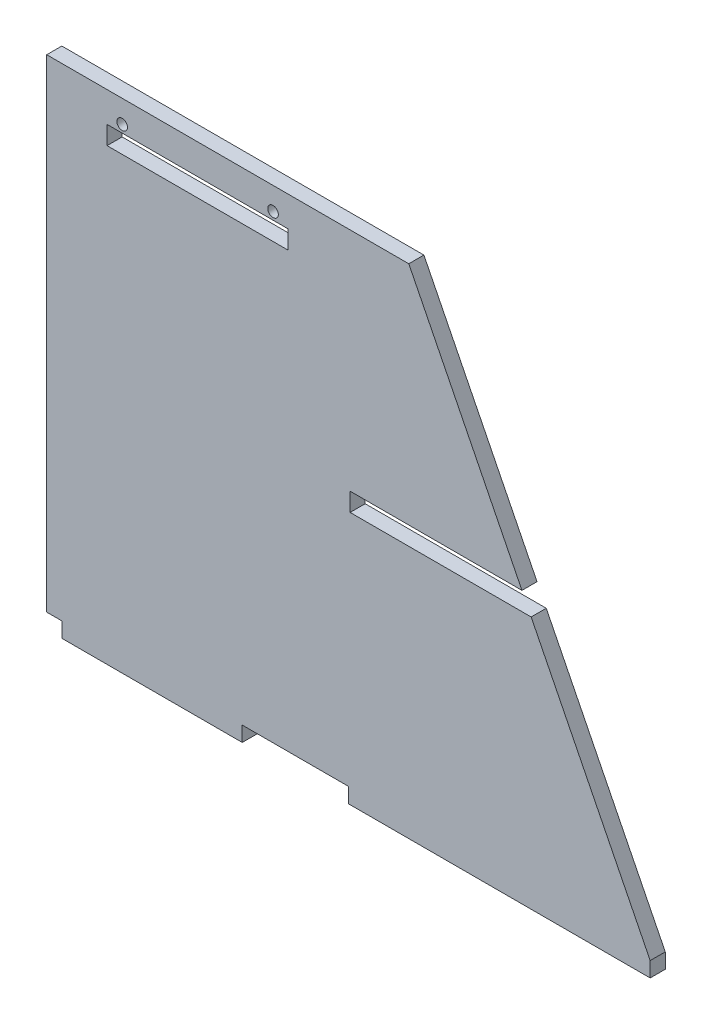
ISO-10303-21;
HEADER;
FILE_DESCRIPTION(('STEP AP214'),'2;1');
FILE_NAME('part.step','',(''),(''),'','','');
FILE_SCHEMA(('AUTOMOTIVE_DESIGN { 1 0 10303 214 1 1 1 1 }'));
ENDSEC;
DATA;
#1=APPLICATION_CONTEXT('core data for automotive mechanical design processes');
#2=APPLICATION_PROTOCOL_DEFINITION('international standard','automotive_design',2000,#1);
#3=PRODUCT_CONTEXT('',#1,'mechanical');
#4=PRODUCT('Part','Part','',(#3));
#5=PRODUCT_RELATED_PRODUCT_CATEGORY('part','',(#4));
#6=PRODUCT_DEFINITION_FORMATION('','',#4);
#7=PRODUCT_DEFINITION_CONTEXT('part definition',#1,'design');
#8=PRODUCT_DEFINITION('design','',#6,#7);
#9=PRODUCT_DEFINITION_SHAPE('','',#8);
#10=(LENGTH_UNIT() NAMED_UNIT(*) SI_UNIT(.MILLI.,.METRE.));
#11=(NAMED_UNIT(*) PLANE_ANGLE_UNIT() SI_UNIT($,.RADIAN.));
#12=(NAMED_UNIT(*) SI_UNIT($,.STERADIAN.) SOLID_ANGLE_UNIT());
#13=UNCERTAINTY_MEASURE_WITH_UNIT(LENGTH_MEASURE(1.E-05),#10,'distance_accuracy_value','');
#14=(GEOMETRIC_REPRESENTATION_CONTEXT(3) GLOBAL_UNCERTAINTY_ASSIGNED_CONTEXT((#13)) GLOBAL_UNIT_ASSIGNED_CONTEXT((#10,
#11,#12)) REPRESENTATION_CONTEXT('',''));
#15=CARTESIAN_POINT('',(0.,0.,0.));
#16=DIRECTION('',(0.,0.,1.));
#17=DIRECTION('',(1.,0.,0.));
#18=AXIS2_PLACEMENT_3D('',#15,#16,#17);
#19=CARTESIAN_POINT('',(160.,80.,5.));
#20=DIRECTION('',(0.894427190999916,0.447213595499958,0.));
#21=DIRECTION('',(-0.447213595499958,0.894427190999916,0.));
#22=AXIS2_PLACEMENT_3D('',#19,#20,#21);
#23=PLANE('',#22);
#24=DIRECTION('',(0.,0.,1.));
#25=VECTOR('',#24,1.);
#26=CARTESIAN_POINT('',(160.55,78.9,0.));
#27=LINE('',#26,#25);
#28=CARTESIAN_POINT('',(160.55,78.9,0.));
#29=VERTEX_POINT('',#28);
#30=CARTESIAN_POINT('',(160.55,78.9,5.));
#31=VERTEX_POINT('',#30);
#32=EDGE_CURVE('E208',#29,#31,#27,.T.);
#33=ORIENTED_EDGE('',*,*,#32,.T.);
#34=DIRECTION('',(0.447213595499958,-0.894427190999916,0.));
#35=VECTOR('',#34,1.);
#36=CARTESIAN_POINT('',(160.,80.,5.));
#37=LINE('',#36,#35);
#38=CARTESIAN_POINT('',(200.,0.,5.));
#39=VERTEX_POINT('',#38);
#40=EDGE_CURVE('E278',#31,#39,#37,.T.);
#41=ORIENTED_EDGE('',*,*,#40,.T.);
#42=DIRECTION('',(0.,0.,-1.));
#43=VECTOR('',#42,1.);
#44=CARTESIAN_POINT('',(200.,0.,5.));
#45=LINE('',#44,#43);
#46=CARTESIAN_POINT('',(200.,0.,0.));
#47=VERTEX_POINT('',#46);
#48=EDGE_CURVE('E296',#39,#47,#45,.T.);
#49=ORIENTED_EDGE('',*,*,#48,.T.);
#50=DIRECTION('',(0.447213595499958,-0.894427190999916,0.));
#51=VECTOR('',#50,1.);
#52=CARTESIAN_POINT('',(160.,80.,0.));
#53=LINE('',#52,#51);
#54=EDGE_CURVE('E300',#29,#47,#53,.T.);
#55=ORIENTED_EDGE('',*,*,#54,.F.);
#56=EDGE_LOOP('',(#33,#41,#49,#55));
#57=FACE_BOUND('',#56,.T.);
#58=ADVANCED_FACE('F71',(#57),#23,.T.);
#59=CARTESIAN_POINT('',(0.,0.,5.));
#60=DIRECTION('',(0.,1.,0.));
#61=DIRECTION('',(-1.,0.,0.));
#62=AXIS2_PLACEMENT_3D('',#59,#60,#61);
#63=PLANE('',#62);
#64=DIRECTION('',(0.,0.,-1.));
#65=VECTOR('',#64,1.);
#66=CARTESIAN_POINT('',(5.,0.,5.));
#67=LINE('',#66,#65);
#68=CARTESIAN_POINT('',(5.,0.,5.));
#69=VERTEX_POINT('',#68);
#70=CARTESIAN_POINT('',(5.,0.,0.));
#71=VERTEX_POINT('',#70);
#72=EDGE_CURVE('E79',#69,#71,#67,.T.);
#73=ORIENTED_EDGE('',*,*,#72,.F.);
#74=DIRECTION('',(1.,0.,0.));
#75=VECTOR('',#74,1.);
#76=CARTESIAN_POINT('',(0.,0.,5.));
#77=LINE('',#76,#75);
#78=CARTESIAN_POINT('',(0.,0.,5.));
#79=VERTEX_POINT('',#78);
#80=EDGE_CURVE('E285',#79,#69,#77,.T.);
#81=ORIENTED_EDGE('',*,*,#80,.F.);
#82=DIRECTION('',(0.,0.,-1.));
#83=VECTOR('',#82,1.);
#84=CARTESIAN_POINT('',(0.,0.,5.));
#85=LINE('',#84,#83);
#86=CARTESIAN_POINT('',(0.,0.,0.));
#87=VERTEX_POINT('',#86);
#88=EDGE_CURVE('E328',#79,#87,#85,.T.);
#89=ORIENTED_EDGE('',*,*,#88,.T.);
#90=DIRECTION('',(1.,0.,0.));
#91=VECTOR('',#90,1.);
#92=CARTESIAN_POINT('',(0.,0.,0.));
#93=LINE('',#92,#91);
#94=EDGE_CURVE('E307',#87,#71,#93,.T.);
#95=ORIENTED_EDGE('',*,*,#94,.T.);
#96=EDGE_LOOP('',(#73,#81,#89,#95));
#97=FACE_BOUND('',#96,.T.);
#98=ADVANCED_FACE('F395',(#97),#63,.F.);
#99=DIRECTION('',(0.,0.,1.));
#100=VECTOR('',#99,1.);
#101=CARTESIAN_POINT('',(157.5,85.,5.));
#102=LINE('',#101,#100);
#103=CARTESIAN_POINT('',(157.5,85.,0.));
#104=VERTEX_POINT('',#103);
#105=CARTESIAN_POINT('',(157.5,85.,5.));
#106=VERTEX_POINT('',#105);
#107=EDGE_CURVE('E227',#104,#106,#102,.T.);
#108=ORIENTED_EDGE('',*,*,#107,.F.);
#109=CARTESIAN_POINT('',(120.,160.,0.));
#110=VERTEX_POINT('',#109);
#111=EDGE_CURVE('E297',#110,#104,#53,.T.);
#112=ORIENTED_EDGE('',*,*,#111,.F.);
#113=DIRECTION('',(0.,0.,-1.));
#114=VECTOR('',#113,1.);
#115=CARTESIAN_POINT('',(120.,160.,5.));
#116=LINE('',#115,#114);
#117=CARTESIAN_POINT('',(120.,160.,5.));
#118=VERTEX_POINT('',#117);
#119=EDGE_CURVE('E332',#118,#110,#116,.T.);
#120=ORIENTED_EDGE('',*,*,#119,.F.);
#121=EDGE_CURVE('E274',#118,#106,#37,.T.);
#122=ORIENTED_EDGE('',*,*,#121,.T.);
#123=EDGE_LOOP('',(#108,#112,#120,#122));
#124=FACE_BOUND('',#123,.T.);
#125=ADVANCED_FACE('F406',(#124),#23,.T.);
#126=CARTESIAN_POINT('',(0.,160.,5.));
#127=DIRECTION('',(0.,1.,0.));
#128=DIRECTION('',(0.,0.,1.));
#129=AXIS2_PLACEMENT_3D('',#126,#127,#128);
#130=PLANE('',#129);
#131=DIRECTION('',(1.,0.,0.));
#132=VECTOR('',#131,1.);
#133=CARTESIAN_POINT('',(0.,160.,0.));
#134=LINE('',#133,#132);
#135=CARTESIAN_POINT('',(0.,160.,0.));
#136=VERTEX_POINT('',#135);
#137=EDGE_CURVE('E299',#136,#110,#134,.T.);
#138=ORIENTED_EDGE('',*,*,#137,.F.);
#139=DIRECTION('',(0.,0.,-1.));
#140=VECTOR('',#139,1.);
#141=CARTESIAN_POINT('',(0.,160.,5.));
#142=LINE('',#141,#140);
#143=CARTESIAN_POINT('',(0.,160.,5.));
#144=VERTEX_POINT('',#143);
#145=EDGE_CURVE('E330',#144,#136,#142,.T.);
#146=ORIENTED_EDGE('',*,*,#145,.F.);
#147=DIRECTION('',(1.,0.,0.));
#148=VECTOR('',#147,1.);
#149=CARTESIAN_POINT('',(0.,160.,5.));
#150=LINE('',#149,#148);
#151=EDGE_CURVE('E277',#144,#118,#150,.T.);
#152=ORIENTED_EDGE('',*,*,#151,.T.);
#153=ORIENTED_EDGE('',*,*,#119,.T.);
#154=EDGE_LOOP('',(#138,#146,#152,#153));
#155=FACE_BOUND('',#154,.T.);
#156=ADVANCED_FACE('F402',(#155),#130,.T.);
#157=CARTESIAN_POINT('',(0.,0.,5.));
#158=DIRECTION('',(-1.,0.,0.));
#159=DIRECTION('',(0.,0.,1.));
#160=AXIS2_PLACEMENT_3D('',#157,#158,#159);
#161=PLANE('',#160);
#162=DIRECTION('',(0.,1.,0.));
#163=VECTOR('',#162,1.);
#164=CARTESIAN_POINT('',(0.,0.,0.));
#165=LINE('',#164,#163);
#166=EDGE_CURVE('E303',#87,#136,#165,.T.);
#167=ORIENTED_EDGE('',*,*,#166,.F.);
#168=ORIENTED_EDGE('',*,*,#88,.F.);
#169=DIRECTION('',(0.,1.,0.));
#170=VECTOR('',#169,1.);
#171=CARTESIAN_POINT('',(0.,0.,5.));
#172=LINE('',#171,#170);
#173=EDGE_CURVE('E281',#79,#144,#172,.T.);
#174=ORIENTED_EDGE('',*,*,#173,.T.);
#175=ORIENTED_EDGE('',*,*,#145,.T.);
#176=EDGE_LOOP('',(#167,#168,#174,#175));
#177=FACE_BOUND('',#176,.T.);
#178=ADVANCED_FACE('F398',(#177),#161,.T.);
#179=CARTESIAN_POINT('',(64.8,0.,5.));
#180=VERTEX_POINT('',#179);
#181=CARTESIAN_POINT('',(100.,0.,5.));
#182=VERTEX_POINT('',#181);
#183=EDGE_CURVE('E284',#180,#182,#77,.T.);
#184=ORIENTED_EDGE('',*,*,#183,.F.);
#185=DIRECTION('',(0.,0.,-1.));
#186=VECTOR('',#185,1.);
#187=CARTESIAN_POINT('',(64.8,0.,5.));
#188=LINE('',#187,#186);
#189=CARTESIAN_POINT('',(64.8,0.,0.));
#190=VERTEX_POINT('',#189);
#191=EDGE_CURVE('E334',#180,#190,#188,.T.);
#192=ORIENTED_EDGE('',*,*,#191,.T.);
#193=CARTESIAN_POINT('',(100.,0.,0.));
#194=VERTEX_POINT('',#193);
#195=EDGE_CURVE('E306',#190,#194,#93,.T.);
#196=ORIENTED_EDGE('',*,*,#195,.T.);
#197=DIRECTION('',(0.,0.,-1.));
#198=VECTOR('',#197,1.);
#199=CARTESIAN_POINT('',(100.,0.,5.));
#200=LINE('',#199,#198);
#201=EDGE_CURVE('E325',#182,#194,#200,.T.);
#202=ORIENTED_EDGE('',*,*,#201,.F.);
#203=EDGE_LOOP('',(#184,#192,#196,#202));
#204=FACE_BOUND('',#203,.T.);
#205=ADVANCED_FACE('F378',(#204),#63,.F.);
#206=CARTESIAN_POINT('',(100.,0.,5.));
#207=DIRECTION('',(1.,0.,0.));
#208=DIRECTION('',(0.,0.,-1.));
#209=AXIS2_PLACEMENT_3D('',#206,#207,#208);
#210=PLANE('',#209);
#211=DIRECTION('',(0.,-1.,0.));
#212=VECTOR('',#211,1.);
#213=CARTESIAN_POINT('',(100.,0.,0.));
#214=LINE('',#213,#212);
#215=CARTESIAN_POINT('',(100.,-5.00000000000001,0.));
#216=VERTEX_POINT('',#215);
#217=EDGE_CURVE('E310',#194,#216,#214,.T.);
#218=ORIENTED_EDGE('',*,*,#217,.T.);
#219=DIRECTION('',(0.,0.,-1.));
#220=VECTOR('',#219,1.);
#221=CARTESIAN_POINT('',(100.,-5.00000000000001,5.));
#222=LINE('',#221,#220);
#223=CARTESIAN_POINT('',(100.,-5.00000000000001,5.));
#224=VERTEX_POINT('',#223);
#225=EDGE_CURVE('E323',#224,#216,#222,.T.);
#226=ORIENTED_EDGE('',*,*,#225,.F.);
#227=DIRECTION('',(0.,-1.,0.));
#228=VECTOR('',#227,1.);
#229=CARTESIAN_POINT('',(100.,0.,5.));
#230=LINE('',#229,#228);
#231=EDGE_CURVE('E288',#182,#224,#230,.T.);
#232=ORIENTED_EDGE('',*,*,#231,.F.);
#233=ORIENTED_EDGE('',*,*,#201,.T.);
#234=EDGE_LOOP('',(#218,#226,#232,#233));
#235=FACE_BOUND('',#234,.T.);
#236=ADVANCED_FACE('F373',(#235),#210,.F.);
#237=CARTESIAN_POINT('',(0.,-5.00000000000002,5.));
#238=DIRECTION('',(0.,-1.,0.));
#239=DIRECTION('',(1.,0.,0.));
#240=AXIS2_PLACEMENT_3D('',#237,#238,#239);
#241=PLANE('',#240);
#242=DIRECTION('',(-1.,0.,0.));
#243=VECTOR('',#242,1.);
#244=CARTESIAN_POINT('',(0.,-5.00000000000002,0.));
#245=LINE('',#244,#243);
#246=CARTESIAN_POINT('',(200.,-4.99999999999999,0.));
#247=VERTEX_POINT('',#246);
#248=EDGE_CURVE('E313',#247,#216,#245,.T.);
#249=ORIENTED_EDGE('',*,*,#248,.F.);
#250=DIRECTION('',(0.,0.,-1.));
#251=VECTOR('',#250,1.);
#252=CARTESIAN_POINT('',(200.,-4.99999999999999,5.));
#253=LINE('',#252,#251);
#254=CARTESIAN_POINT('',(200.,-4.99999999999999,5.));
#255=VERTEX_POINT('',#254);
#256=EDGE_CURVE('E321',#255,#247,#253,.T.);
#257=ORIENTED_EDGE('',*,*,#256,.F.);
#258=DIRECTION('',(-1.,0.,0.));
#259=VECTOR('',#258,1.);
#260=CARTESIAN_POINT('',(0.,-5.00000000000002,5.));
#261=LINE('',#260,#259);
#262=EDGE_CURVE('E290',#255,#224,#261,.T.);
#263=ORIENTED_EDGE('',*,*,#262,.T.);
#264=ORIENTED_EDGE('',*,*,#225,.T.);
#265=EDGE_LOOP('',(#249,#257,#263,#264));
#266=FACE_BOUND('',#265,.T.);
#267=ADVANCED_FACE('F368',(#266),#241,.T.);
#268=CARTESIAN_POINT('',(200.,0.,5.));
#269=DIRECTION('',(1.,0.,0.));
#270=DIRECTION('',(0.,0.,-1.));
#271=AXIS2_PLACEMENT_3D('',#268,#269,#270);
#272=PLANE('',#271);
#273=DIRECTION('',(0.,-1.,0.));
#274=VECTOR('',#273,1.);
#275=CARTESIAN_POINT('',(200.,0.,0.));
#276=LINE('',#275,#274);
#277=EDGE_CURVE('E316',#47,#247,#276,.T.);
#278=ORIENTED_EDGE('',*,*,#277,.F.);
#279=ORIENTED_EDGE('',*,*,#48,.F.);
#280=DIRECTION('',(0.,-1.,0.));
#281=VECTOR('',#280,1.);
#282=CARTESIAN_POINT('',(200.,0.,5.));
#283=LINE('',#282,#281);
#284=EDGE_CURVE('E293',#39,#255,#283,.T.);
#285=ORIENTED_EDGE('',*,*,#284,.T.);
#286=ORIENTED_EDGE('',*,*,#256,.T.);
#287=EDGE_LOOP('',(#278,#279,#285,#286));
#288=FACE_BOUND('',#287,.T.);
#289=ADVANCED_FACE('F364',(#288),#272,.T.);
#290=CARTESIAN_POINT('',(0.,0.,5.));
#291=DIRECTION('',(0.,0.,1.));
#292=DIRECTION('',(1.,0.,0.));
#293=AXIS2_PLACEMENT_3D('',#290,#291,#292);
#294=PLANE('',#293);
#295=DIRECTION('',(1.,0.,0.));
#296=VECTOR('',#295,1.);
#297=CARTESIAN_POINT('',(160.55,78.9,5.));
#298=LINE('',#297,#296);
#299=CARTESIAN_POINT('',(100.55,78.9,5.));
#300=VERTEX_POINT('',#299);
#301=EDGE_CURVE('E220',#300,#31,#298,.T.);
#302=ORIENTED_EDGE('',*,*,#301,.F.);
#303=DIRECTION('',(0.,-1.,0.));
#304=VECTOR('',#303,1.);
#305=CARTESIAN_POINT('',(100.55,78.9,5.));
#306=LINE('',#305,#304);
#307=CARTESIAN_POINT('',(100.55,85.,5.));
#308=VERTEX_POINT('',#307);
#309=EDGE_CURVE('E205',#308,#300,#306,.T.);
#310=ORIENTED_EDGE('',*,*,#309,.F.);
#311=DIRECTION('',(-1.,0.,0.));
#312=VECTOR('',#311,1.);
#313=CARTESIAN_POINT('',(160.55,85.,5.));
#314=LINE('',#313,#312);
#315=EDGE_CURVE('E224',#106,#308,#314,.T.);
#316=ORIENTED_EDGE('',*,*,#315,.F.);
#317=ORIENTED_EDGE('',*,*,#121,.F.);
#318=ORIENTED_EDGE('',*,*,#151,.F.);
#319=ORIENTED_EDGE('',*,*,#173,.F.);
#320=ORIENTED_EDGE('',*,*,#80,.T.);
#321=DIRECTION('',(0.,-1.,0.));
#322=VECTOR('',#321,1.);
#323=CARTESIAN_POINT('',(5.,0.,5.));
#324=LINE('',#323,#322);
#325=CARTESIAN_POINT('',(5.,-5.,5.));
#326=VERTEX_POINT('',#325);
#327=EDGE_CURVE('E337',#69,#326,#324,.T.);
#328=ORIENTED_EDGE('',*,*,#327,.T.);
#329=DIRECTION('',(1.,0.,0.));
#330=VECTOR('',#329,1.);
#331=CARTESIAN_POINT('',(5.,-5.,5.));
#332=LINE('',#331,#330);
#333=CARTESIAN_POINT('',(64.8,-5.,5.));
#334=VERTEX_POINT('',#333);
#335=EDGE_CURVE('E340',#326,#334,#332,.T.);
#336=ORIENTED_EDGE('',*,*,#335,.T.);
#337=DIRECTION('',(0.,-1.,0.));
#338=VECTOR('',#337,1.);
#339=CARTESIAN_POINT('',(64.8,0.,5.));
#340=LINE('',#339,#338);
#341=EDGE_CURVE('E343',#180,#334,#340,.T.);
#342=ORIENTED_EDGE('',*,*,#341,.F.);
#343=ORIENTED_EDGE('',*,*,#183,.T.);
#344=ORIENTED_EDGE('',*,*,#231,.T.);
#345=ORIENTED_EDGE('',*,*,#262,.F.);
#346=ORIENTED_EDGE('',*,*,#284,.F.);
#347=ORIENTED_EDGE('',*,*,#40,.F.);
#348=EDGE_LOOP('',(#302,#310,#316,#317,#318,#319,#320,#328,#336,#342,#343,#344,#345,#346,#347));
#349=FACE_BOUND('',#348,.T.);
#350=CARTESIAN_POINT('',(25.,152.5,5.));
#351=DIRECTION('',(0.,0.,1.));
#352=DIRECTION('',(1.,0.,0.));
#353=AXIS2_PLACEMENT_3D('',#350,#351,#352);
#354=CIRCLE('',#353,1.75);
#355=CARTESIAN_POINT('',(26.75,152.5,5.));
#356=VERTEX_POINT('',#355);
#357=EDGE_CURVE('E235',#356,#356,#354,.T.);
#358=ORIENTED_EDGE('',*,*,#357,.F.);
#359=EDGE_LOOP('',(#358));
#360=FACE_BOUND('',#359,.T.);
#361=CARTESIAN_POINT('',(75.,152.5,5.));
#362=DIRECTION('',(0.,0.,1.));
#363=DIRECTION('',(-1.,0.,0.));
#364=AXIS2_PLACEMENT_3D('',#361,#362,#363);
#365=CIRCLE('',#364,1.75000000000001);
#366=CARTESIAN_POINT('',(73.25,152.5,5.));
#367=VERTEX_POINT('',#366);
#368=EDGE_CURVE('E231',#367,#367,#365,.T.);
#369=ORIENTED_EDGE('',*,*,#368,.F.);
#370=EDGE_LOOP('',(#369));
#371=FACE_BOUND('',#370,.T.);
#372=DIRECTION('',(0.,-1.,0.));
#373=VECTOR('',#372,1.);
#374=CARTESIAN_POINT('',(20.,150.,5.));
#375=LINE('',#374,#373);
#376=CARTESIAN_POINT('',(20.,150.,5.));
#377=VERTEX_POINT('',#376);
#378=CARTESIAN_POINT('',(20.,143.9,5.));
#379=VERTEX_POINT('',#378);
#380=EDGE_CURVE('E94',#377,#379,#375,.T.);
#381=ORIENTED_EDGE('',*,*,#380,.F.);
#382=DIRECTION('',(-1.,0.,0.));
#383=VECTOR('',#382,1.);
#384=CARTESIAN_POINT('',(20.,150.,5.));
#385=LINE('',#384,#383);
#386=CARTESIAN_POINT('',(80.,150.,5.));
#387=VERTEX_POINT('',#386);
#388=EDGE_CURVE('E247',#387,#377,#385,.T.);
#389=ORIENTED_EDGE('',*,*,#388,.F.);
#390=DIRECTION('',(0.,1.,0.));
#391=VECTOR('',#390,1.);
#392=CARTESIAN_POINT('',(80.,150.,5.));
#393=LINE('',#392,#391);
#394=CARTESIAN_POINT('',(80.,143.9,5.));
#395=VERTEX_POINT('',#394);
#396=EDGE_CURVE('E261',#395,#387,#393,.T.);
#397=ORIENTED_EDGE('',*,*,#396,.F.);
#398=DIRECTION('',(1.,0.,0.));
#399=VECTOR('',#398,1.);
#400=CARTESIAN_POINT('',(20.,143.9,5.));
#401=LINE('',#400,#399);
#402=EDGE_CURVE('E258',#379,#395,#401,.T.);
#403=ORIENTED_EDGE('',*,*,#402,.F.);
#404=EDGE_LOOP('',(#381,#389,#397,#403));
#405=FACE_BOUND('',#404,.T.);
#406=ADVANCED_FACE('F388',(#349,#360,#371,#405),#294,.T.);
#407=CARTESIAN_POINT('',(0.,0.,0.));
#408=DIRECTION('',(0.,0.,1.));
#409=DIRECTION('',(1.,0.,0.));
#410=AXIS2_PLACEMENT_3D('',#407,#408,#409);
#411=PLANE('',#410);
#412=CARTESIAN_POINT('',(25.,152.5,0.));
#413=DIRECTION('',(0.,0.,1.));
#414=DIRECTION('',(1.,0.,0.));
#415=AXIS2_PLACEMENT_3D('',#412,#413,#414);
#416=CIRCLE('',#415,1.75);
#417=CARTESIAN_POINT('',(26.75,152.5,0.));
#418=VERTEX_POINT('',#417);
#419=EDGE_CURVE('E232',#418,#418,#416,.T.);
#420=ORIENTED_EDGE('',*,*,#419,.T.);
#421=EDGE_LOOP('',(#420));
#422=FACE_BOUND('',#421,.T.);
#423=CARTESIAN_POINT('',(75.,152.5,0.));
#424=DIRECTION('',(0.,0.,1.));
#425=DIRECTION('',(-1.,0.,0.));
#426=AXIS2_PLACEMENT_3D('',#423,#424,#425);
#427=CIRCLE('',#426,1.75000000000001);
#428=CARTESIAN_POINT('',(73.25,152.5,0.));
#429=VERTEX_POINT('',#428);
#430=EDGE_CURVE('E238',#429,#429,#427,.T.);
#431=ORIENTED_EDGE('',*,*,#430,.T.);
#432=EDGE_LOOP('',(#431));
#433=FACE_BOUND('',#432,.T.);
#434=DIRECTION('',(-1.,0.,0.));
#435=VECTOR('',#434,1.);
#436=CARTESIAN_POINT('',(20.,150.,0.));
#437=LINE('',#436,#435);
#438=CARTESIAN_POINT('',(80.,150.,0.));
#439=VERTEX_POINT('',#438);
#440=CARTESIAN_POINT('',(20.,150.,0.));
#441=VERTEX_POINT('',#440);
#442=EDGE_CURVE('E253',#439,#441,#437,.T.);
#443=ORIENTED_EDGE('',*,*,#442,.T.);
#444=DIRECTION('',(0.,-1.,0.));
#445=VECTOR('',#444,1.);
#446=CARTESIAN_POINT('',(20.,150.,0.));
#447=LINE('',#446,#445);
#448=CARTESIAN_POINT('',(20.,143.9,0.));
#449=VERTEX_POINT('',#448);
#450=EDGE_CURVE('E243',#441,#449,#447,.T.);
#451=ORIENTED_EDGE('',*,*,#450,.T.);
#452=DIRECTION('',(1.,0.,0.));
#453=VECTOR('',#452,1.);
#454=CARTESIAN_POINT('',(20.,143.9,0.));
#455=LINE('',#454,#453);
#456=CARTESIAN_POINT('',(80.,143.9,0.));
#457=VERTEX_POINT('',#456);
#458=EDGE_CURVE('E246',#449,#457,#455,.T.);
#459=ORIENTED_EDGE('',*,*,#458,.T.);
#460=DIRECTION('',(0.,1.,0.));
#461=VECTOR('',#460,1.);
#462=CARTESIAN_POINT('',(80.,150.,0.));
#463=LINE('',#462,#461);
#464=EDGE_CURVE('E250',#457,#439,#463,.T.);
#465=ORIENTED_EDGE('',*,*,#464,.T.);
#466=EDGE_LOOP('',(#443,#451,#459,#465));
#467=FACE_BOUND('',#466,.T.);
#468=DIRECTION('',(0.,-1.,0.));
#469=VECTOR('',#468,1.);
#470=CARTESIAN_POINT('',(100.55,78.9,0.));
#471=LINE('',#470,#469);
#472=CARTESIAN_POINT('',(100.55,85.,0.));
#473=VERTEX_POINT('',#472);
#474=CARTESIAN_POINT('',(100.55,78.9,0.));
#475=VERTEX_POINT('',#474);
#476=EDGE_CURVE('E86',#473,#475,#471,.T.);
#477=ORIENTED_EDGE('',*,*,#476,.T.);
#478=DIRECTION('',(1.,0.,0.));
#479=VECTOR('',#478,1.);
#480=CARTESIAN_POINT('',(160.55,78.9,0.));
#481=LINE('',#480,#479);
#482=EDGE_CURVE('E212',#475,#29,#481,.T.);
#483=ORIENTED_EDGE('',*,*,#482,.T.);
#484=ORIENTED_EDGE('',*,*,#54,.T.);
#485=ORIENTED_EDGE('',*,*,#277,.T.);
#486=ORIENTED_EDGE('',*,*,#248,.T.);
#487=ORIENTED_EDGE('',*,*,#217,.F.);
#488=ORIENTED_EDGE('',*,*,#195,.F.);
#489=DIRECTION('',(0.,-1.,0.));
#490=VECTOR('',#489,1.);
#491=CARTESIAN_POINT('',(64.8,0.,0.));
#492=LINE('',#491,#490);
#493=CARTESIAN_POINT('',(64.8,-5.,0.));
#494=VERTEX_POINT('',#493);
#495=EDGE_CURVE('E341',#190,#494,#492,.T.);
#496=ORIENTED_EDGE('',*,*,#495,.T.);
#497=DIRECTION('',(1.,0.,0.));
#498=VECTOR('',#497,1.);
#499=CARTESIAN_POINT('',(5.,-5.,0.));
#500=LINE('',#499,#498);
#501=CARTESIAN_POINT('',(5.,-5.,0.));
#502=VERTEX_POINT('',#501);
#503=EDGE_CURVE('E349',#502,#494,#500,.T.);
#504=ORIENTED_EDGE('',*,*,#503,.F.);
#505=DIRECTION('',(0.,-1.,0.));
#506=VECTOR('',#505,1.);
#507=CARTESIAN_POINT('',(5.,0.,0.));
#508=LINE('',#507,#506);
#509=EDGE_CURVE('E268',#71,#502,#508,.T.);
#510=ORIENTED_EDGE('',*,*,#509,.F.);
#511=ORIENTED_EDGE('',*,*,#94,.F.);
#512=ORIENTED_EDGE('',*,*,#166,.T.);
#513=ORIENTED_EDGE('',*,*,#137,.T.);
#514=ORIENTED_EDGE('',*,*,#111,.T.);
#515=DIRECTION('',(-1.,0.,0.));
#516=VECTOR('',#515,1.);
#517=CARTESIAN_POINT('',(0.,85.,0.));
#518=LINE('',#517,#516);
#519=EDGE_CURVE('E12',#104,#473,#518,.T.);
#520=ORIENTED_EDGE('',*,*,#519,.T.);
#521=EDGE_LOOP('',(#477,#483,#484,#485,#486,#487,#488,#496,#504,#510,#511,#512,#513,#514,#520));
#522=FACE_BOUND('',#521,.T.);
#523=ADVANCED_FACE('F218',(#422,#433,#467,#522),#411,.F.);
#524=CARTESIAN_POINT('',(5.,-5.,5.));
#525=DIRECTION('',(0.,1.,0.));
#526=DIRECTION('',(0.,0.,1.));
#527=AXIS2_PLACEMENT_3D('',#524,#525,#526);
#528=PLANE('',#527);
#529=ORIENTED_EDGE('',*,*,#503,.T.);
#530=DIRECTION('',(0.,0.,-1.));
#531=VECTOR('',#530,1.);
#532=CARTESIAN_POINT('',(64.8,-5.,5.));
#533=LINE('',#532,#531);
#534=EDGE_CURVE('E346',#334,#494,#533,.T.);
#535=ORIENTED_EDGE('',*,*,#534,.F.);
#536=ORIENTED_EDGE('',*,*,#335,.F.);
#537=DIRECTION('',(0.,0.,-1.));
#538=VECTOR('',#537,1.);
#539=CARTESIAN_POINT('',(5.,-5.,5.));
#540=LINE('',#539,#538);
#541=EDGE_CURVE('E354',#326,#502,#540,.T.);
#542=ORIENTED_EDGE('',*,*,#541,.T.);
#543=EDGE_LOOP('',(#529,#535,#536,#542));
#544=FACE_BOUND('',#543,.T.);
#545=ADVANCED_FACE('F386',(#544),#528,.F.);
#546=CARTESIAN_POINT('',(64.8,0.,5.));
#547=DIRECTION('',(1.,0.,0.));
#548=DIRECTION('',(0.,0.,-1.));
#549=AXIS2_PLACEMENT_3D('',#546,#547,#548);
#550=PLANE('',#549);
#551=ORIENTED_EDGE('',*,*,#495,.F.);
#552=ORIENTED_EDGE('',*,*,#191,.F.);
#553=ORIENTED_EDGE('',*,*,#341,.T.);
#554=ORIENTED_EDGE('',*,*,#534,.T.);
#555=EDGE_LOOP('',(#551,#552,#553,#554));
#556=FACE_BOUND('',#555,.T.);
#557=ADVANCED_FACE('F382',(#556),#550,.T.);
#558=CARTESIAN_POINT('',(5.,0.,5.));
#559=DIRECTION('',(1.,0.,0.));
#560=DIRECTION('',(0.,1.,0.));
#561=AXIS2_PLACEMENT_3D('',#558,#559,#560);
#562=PLANE('',#561);
#563=ORIENTED_EDGE('',*,*,#509,.T.);
#564=ORIENTED_EDGE('',*,*,#541,.F.);
#565=ORIENTED_EDGE('',*,*,#327,.F.);
#566=ORIENTED_EDGE('',*,*,#72,.T.);
#567=EDGE_LOOP('',(#563,#564,#565,#566));
#568=FACE_BOUND('',#567,.T.);
#569=ADVANCED_FACE('F73',(#568),#562,.F.);
#570=CARTESIAN_POINT('',(20.,150.,0.));
#571=DIRECTION('',(-1.,0.,0.));
#572=DIRECTION('',(0.,0.,1.));
#573=AXIS2_PLACEMENT_3D('',#570,#571,#572);
#574=PLANE('',#573);
#575=ORIENTED_EDGE('',*,*,#380,.T.);
#576=DIRECTION('',(0.,0.,1.));
#577=VECTOR('',#576,1.);
#578=CARTESIAN_POINT('',(20.,143.9,0.));
#579=LINE('',#578,#577);
#580=EDGE_CURVE('E256',#449,#379,#579,.T.);
#581=ORIENTED_EDGE('',*,*,#580,.F.);
#582=ORIENTED_EDGE('',*,*,#450,.F.);
#583=DIRECTION('',(0.,0.,1.));
#584=VECTOR('',#583,1.);
#585=CARTESIAN_POINT('',(20.,150.,0.));
#586=LINE('',#585,#584);
#587=EDGE_CURVE('E266',#441,#377,#586,.T.);
#588=ORIENTED_EDGE('',*,*,#587,.T.);
#589=EDGE_LOOP('',(#575,#581,#582,#588));
#590=FACE_BOUND('',#589,.T.);
#591=ADVANCED_FACE('F428',(#590),#574,.F.);
#592=CARTESIAN_POINT('',(20.,150.,0.));
#593=DIRECTION('',(0.,1.,0.));
#594=DIRECTION('',(0.,0.,1.));
#595=AXIS2_PLACEMENT_3D('',#592,#593,#594);
#596=PLANE('',#595);
#597=ORIENTED_EDGE('',*,*,#388,.T.);
#598=ORIENTED_EDGE('',*,*,#587,.F.);
#599=ORIENTED_EDGE('',*,*,#442,.F.);
#600=DIRECTION('',(0.,0.,1.));
#601=VECTOR('',#600,1.);
#602=CARTESIAN_POINT('',(80.,150.,0.));
#603=LINE('',#602,#601);
#604=EDGE_CURVE('E269',#439,#387,#603,.T.);
#605=ORIENTED_EDGE('',*,*,#604,.T.);
#606=EDGE_LOOP('',(#597,#598,#599,#605));
#607=FACE_BOUND('',#606,.T.);
#608=ADVANCED_FACE('F433',(#607),#596,.F.);
#609=CARTESIAN_POINT('',(80.,150.,0.));
#610=DIRECTION('',(1.,0.,0.));
#611=DIRECTION('',(0.,0.,-1.));
#612=AXIS2_PLACEMENT_3D('',#609,#610,#611);
#613=PLANE('',#612);
#614=ORIENTED_EDGE('',*,*,#396,.T.);
#615=ORIENTED_EDGE('',*,*,#604,.F.);
#616=ORIENTED_EDGE('',*,*,#464,.F.);
#617=DIRECTION('',(0.,0.,1.));
#618=VECTOR('',#617,1.);
#619=CARTESIAN_POINT('',(80.,143.9,0.));
#620=LINE('',#619,#618);
#621=EDGE_CURVE('E271',#457,#395,#620,.T.);
#622=ORIENTED_EDGE('',*,*,#621,.T.);
#623=EDGE_LOOP('',(#614,#615,#616,#622));
#624=FACE_BOUND('',#623,.T.);
#625=ADVANCED_FACE('F537',(#624),#613,.F.);
#626=CARTESIAN_POINT('',(20.,143.9,0.));
#627=DIRECTION('',(0.,-1.,0.));
#628=DIRECTION('',(0.,0.,-1.));
#629=AXIS2_PLACEMENT_3D('',#626,#627,#628);
#630=PLANE('',#629);
#631=ORIENTED_EDGE('',*,*,#402,.T.);
#632=ORIENTED_EDGE('',*,*,#621,.F.);
#633=ORIENTED_EDGE('',*,*,#458,.F.);
#634=ORIENTED_EDGE('',*,*,#580,.T.);
#635=EDGE_LOOP('',(#631,#632,#633,#634));
#636=FACE_BOUND('',#635,.T.);
#637=ADVANCED_FACE('F529',(#636),#630,.F.);
#638=CARTESIAN_POINT('',(75.,152.5,0.));
#639=DIRECTION('',(0.,0.,1.));
#640=DIRECTION('',(1.,0.,0.));
#641=AXIS2_PLACEMENT_3D('',#638,#639,#640);
#642=CYLINDRICAL_SURFACE('',#641,1.75000000000001);
#643=ORIENTED_EDGE('',*,*,#430,.F.);
#644=EDGE_LOOP('',(#643));
#645=FACE_BOUND('',#644,.T.);
#646=ORIENTED_EDGE('',*,*,#368,.T.);
#647=EDGE_LOOP('',(#646));
#648=FACE_BOUND('',#647,.T.);
#649=ADVANCED_FACE('F522',(#645,#648),#642,.F.);
#650=CARTESIAN_POINT('',(25.,152.5,0.));
#651=DIRECTION('',(0.,0.,1.));
#652=DIRECTION('',(1.,0.,0.));
#653=AXIS2_PLACEMENT_3D('',#650,#651,#652);
#654=CYLINDRICAL_SURFACE('',#653,1.75);
#655=ORIENTED_EDGE('',*,*,#419,.F.);
#656=EDGE_LOOP('',(#655));
#657=FACE_BOUND('',#656,.T.);
#658=ORIENTED_EDGE('',*,*,#357,.T.);
#659=EDGE_LOOP('',(#658));
#660=FACE_BOUND('',#659,.T.);
#661=ADVANCED_FACE('F503',(#657,#660),#654,.F.);
#662=CARTESIAN_POINT('',(160.55,78.9,0.));
#663=DIRECTION('',(0.,-1.,0.));
#664=DIRECTION('',(0.,0.,-1.));
#665=AXIS2_PLACEMENT_3D('',#662,#663,#664);
#666=PLANE('',#665);
#667=ORIENTED_EDGE('',*,*,#301,.T.);
#668=ORIENTED_EDGE('',*,*,#32,.F.);
#669=ORIENTED_EDGE('',*,*,#482,.F.);
#670=DIRECTION('',(0.,0.,1.));
#671=VECTOR('',#670,1.);
#672=CARTESIAN_POINT('',(100.55,78.9,0.));
#673=LINE('',#672,#671);
#674=EDGE_CURVE('E201',#475,#300,#673,.T.);
#675=ORIENTED_EDGE('',*,*,#674,.T.);
#676=EDGE_LOOP('',(#667,#668,#669,#675));
#677=FACE_BOUND('',#676,.T.);
#678=ADVANCED_FACE('F213',(#677),#666,.F.);
#679=CARTESIAN_POINT('',(100.55,78.9,0.));
#680=DIRECTION('',(-1.,0.,0.));
#681=DIRECTION('',(0.,0.,1.));
#682=AXIS2_PLACEMENT_3D('',#679,#680,#681);
#683=PLANE('',#682);
#684=ORIENTED_EDGE('',*,*,#309,.T.);
#685=ORIENTED_EDGE('',*,*,#674,.F.);
#686=ORIENTED_EDGE('',*,*,#476,.F.);
#687=DIRECTION('',(0.,0.,1.));
#688=VECTOR('',#687,1.);
#689=CARTESIAN_POINT('',(100.55,85.,0.));
#690=LINE('',#689,#688);
#691=EDGE_CURVE('E209',#473,#308,#690,.T.);
#692=ORIENTED_EDGE('',*,*,#691,.T.);
#693=EDGE_LOOP('',(#684,#685,#686,#692));
#694=FACE_BOUND('',#693,.T.);
#695=ADVANCED_FACE('F203',(#694),#683,.F.);
#696=CARTESIAN_POINT('',(160.55,85.,0.));
#697=DIRECTION('',(0.,1.,0.));
#698=DIRECTION('',(-1.,0.,0.));
#699=AXIS2_PLACEMENT_3D('',#696,#697,#698);
#700=PLANE('',#699);
#701=ORIENTED_EDGE('',*,*,#107,.T.);
#702=ORIENTED_EDGE('',*,*,#315,.T.);
#703=ORIENTED_EDGE('',*,*,#691,.F.);
#704=ORIENTED_EDGE('',*,*,#519,.F.);
#705=EDGE_LOOP('',(#701,#702,#703,#704));
#706=FACE_BOUND('',#705,.T.);
#707=ADVANCED_FACE('F410',(#706),#700,.F.);
#708=CLOSED_SHELL('',(#58,#98,#125,#156,#178,#205,#236,#267,#289,#406,#523,#545,#557,#569,#591,
#608,#625,#637,#649,#661,#678,#695,#707));
#709=MANIFOLD_SOLID_BREP('B2',#708);
#710=ADVANCED_BREP_SHAPE_REPRESENTATION('',(#18,#709),#14);
#711=SHAPE_DEFINITION_REPRESENTATION(#9,#710);
ENDSEC;
END-ISO-10303-21;
